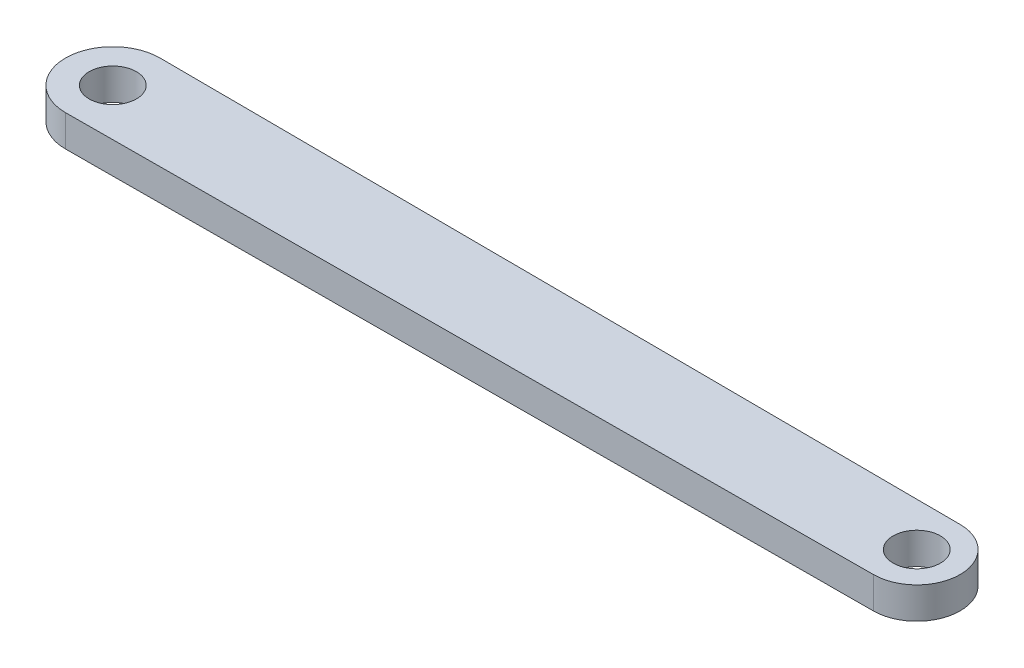
ISO-10303-21;
HEADER;
FILE_DESCRIPTION(('STEP AP214'),'2;1');
FILE_NAME('part.step','',(''),(''),'','','');
FILE_SCHEMA(('AUTOMOTIVE_DESIGN { 1 0 10303 214 1 1 1 1 }'));
ENDSEC;
DATA;
#1=APPLICATION_CONTEXT('core data for automotive mechanical design processes');
#2=APPLICATION_PROTOCOL_DEFINITION('international standard','automotive_design',2000,#1);
#3=PRODUCT_CONTEXT('',#1,'mechanical');
#4=PRODUCT('Part','Part','',(#3));
#5=PRODUCT_RELATED_PRODUCT_CATEGORY('part','',(#4));
#6=PRODUCT_DEFINITION_FORMATION('','',#4);
#7=PRODUCT_DEFINITION_CONTEXT('part definition',#1,'design');
#8=PRODUCT_DEFINITION('design','',#6,#7);
#9=PRODUCT_DEFINITION_SHAPE('','',#8);
#10=(LENGTH_UNIT() NAMED_UNIT(*) SI_UNIT(.MILLI.,.METRE.));
#11=(NAMED_UNIT(*) PLANE_ANGLE_UNIT() SI_UNIT($,.RADIAN.));
#12=(NAMED_UNIT(*) SI_UNIT($,.STERADIAN.) SOLID_ANGLE_UNIT());
#13=UNCERTAINTY_MEASURE_WITH_UNIT(LENGTH_MEASURE(1.E-05),#10,'distance_accuracy_value','');
#14=(GEOMETRIC_REPRESENTATION_CONTEXT(3) GLOBAL_UNCERTAINTY_ASSIGNED_CONTEXT((#13)) GLOBAL_UNIT_ASSIGNED_CONTEXT((#10,
#11,#12)) REPRESENTATION_CONTEXT('',''));
#15=CARTESIAN_POINT('',(0.,0.,0.));
#16=DIRECTION('',(0.,0.,1.));
#17=DIRECTION('',(1.,0.,0.));
#18=AXIS2_PLACEMENT_3D('',#15,#16,#17);
#19=CARTESIAN_POINT('',(-51.,1.,0.));
#20=DIRECTION('',(0.,1.,0.));
#21=DIRECTION('',(0.,0.,1.));
#22=AXIS2_PLACEMENT_3D('',#19,#20,#21);
#23=PLANE('',#22);
#24=CARTESIAN_POINT('',(0.,1.,0.));
#25=DIRECTION('',(0.,1.,0.));
#26=DIRECTION('',(0.,0.,1.));
#27=AXIS2_PLACEMENT_3D('',#24,#25,#26);
#28=CIRCLE('',#27,1.5);
#29=CARTESIAN_POINT('',(0.,1.,1.5));
#30=VERTEX_POINT('',#29);
#31=EDGE_CURVE('E136',#30,#30,#28,.T.);
#32=ORIENTED_EDGE('',*,*,#31,.F.);
#33=EDGE_LOOP('',(#32));
#34=FACE_BOUND('',#33,.T.);
#35=CARTESIAN_POINT('',(-51.,1.,0.));
#36=DIRECTION('',(0.,1.,0.));
#37=DIRECTION('',(0.,0.,1.));
#38=AXIS2_PLACEMENT_3D('',#35,#36,#37);
#39=CIRCLE('',#38,3.);
#40=CARTESIAN_POINT('',(-50.9852941176471,1.,-2.99996395595418));
#41=VERTEX_POINT('',#40);
#42=CARTESIAN_POINT('',(-50.9852941176471,1.,2.99996395595418));
#43=VERTEX_POINT('',#42);
#44=EDGE_CURVE('E94',#41,#43,#39,.T.);
#45=ORIENTED_EDGE('',*,*,#44,.T.);
#46=DIRECTION('',(0.999987985318058,0.,-0.00490196078431374));
#47=VECTOR('',#46,1.);
#48=CARTESIAN_POINT('',(-50.9852941176471,1.,2.99996395595418));
#49=LINE('',#48,#47);
#50=CARTESIAN_POINT('',(0.0134803921568628,1.,2.74996695962466));
#51=VERTEX_POINT('',#50);
#52=EDGE_CURVE('E89',#43,#51,#49,.T.);
#53=ORIENTED_EDGE('',*,*,#52,.T.);
#54=CARTESIAN_POINT('',(0.,1.,0.));
#55=DIRECTION('',(0.,1.,0.));
#56=DIRECTION('',(0.,0.,1.));
#57=AXIS2_PLACEMENT_3D('',#54,#55,#56);
#58=CIRCLE('',#57,2.75);
#59=CARTESIAN_POINT('',(0.0134803921568628,1.,-2.74996695962466));
#60=VERTEX_POINT('',#59);
#61=EDGE_CURVE('E92',#51,#60,#58,.T.);
#62=ORIENTED_EDGE('',*,*,#61,.T.);
#63=DIRECTION('',(-0.999987985318058,0.,-0.00490196078431374));
#64=VECTOR('',#63,1.);
#65=CARTESIAN_POINT('',(-50.9852941176471,1.,-2.99996395595418));
#66=LINE('',#65,#64);
#67=EDGE_CURVE('E59',#60,#41,#66,.T.);
#68=ORIENTED_EDGE('',*,*,#67,.T.);
#69=EDGE_LOOP('',(#45,#53,#62,#68));
#70=FACE_BOUND('',#69,.T.);
#71=CARTESIAN_POINT('',(-51.,1.,0.));
#72=DIRECTION('',(0.,1.,0.));
#73=DIRECTION('',(0.,0.,1.));
#74=AXIS2_PLACEMENT_3D('',#71,#72,#73);
#75=CIRCLE('',#74,1.5);
#76=CARTESIAN_POINT('',(-51.,1.,1.5));
#77=VERTEX_POINT('',#76);
#78=EDGE_CURVE('E114',#77,#77,#75,.T.);
#79=ORIENTED_EDGE('',*,*,#78,.F.);
#80=EDGE_LOOP('',(#79));
#81=FACE_BOUND('',#80,.T.);
#82=ADVANCED_FACE('F41',(#34,#70,#81),#23,.T.);
#83=CARTESIAN_POINT('',(-51.,-1.,0.));
#84=DIRECTION('',(0.,1.,0.));
#85=DIRECTION('',(0.,0.,1.));
#86=AXIS2_PLACEMENT_3D('',#83,#84,#85);
#87=PLANE('',#86);
#88=CARTESIAN_POINT('',(0.,-1.,0.));
#89=DIRECTION('',(0.,1.,0.));
#90=DIRECTION('',(0.,0.,1.));
#91=AXIS2_PLACEMENT_3D('',#88,#89,#90);
#92=CIRCLE('',#91,1.5);
#93=CARTESIAN_POINT('',(0.,-1.,1.5));
#94=VERTEX_POINT('',#93);
#95=EDGE_CURVE('E143',#94,#94,#92,.T.);
#96=ORIENTED_EDGE('',*,*,#95,.T.);
#97=EDGE_LOOP('',(#96));
#98=FACE_BOUND('',#97,.T.);
#99=CARTESIAN_POINT('',(-51.,-1.,0.));
#100=DIRECTION('',(0.,1.,0.));
#101=DIRECTION('',(0.,0.,1.));
#102=AXIS2_PLACEMENT_3D('',#99,#100,#101);
#103=CIRCLE('',#102,3.);
#104=CARTESIAN_POINT('',(-50.9852941176471,-1.,-2.99996395595418));
#105=VERTEX_POINT('',#104);
#106=CARTESIAN_POINT('',(-50.9852941176471,-1.,2.99996395595418));
#107=VERTEX_POINT('',#106);
#108=EDGE_CURVE('E110',#105,#107,#103,.T.);
#109=ORIENTED_EDGE('',*,*,#108,.F.);
#110=DIRECTION('',(-0.999987985318058,0.,-0.00490196078431374));
#111=VECTOR('',#110,1.);
#112=CARTESIAN_POINT('',(-50.9852941176471,-1.,-2.99996395595418));
#113=LINE('',#112,#111);
#114=CARTESIAN_POINT('',(0.0134803921568628,-1.,-2.74996695962466));
#115=VERTEX_POINT('',#114);
#116=EDGE_CURVE('E82',#115,#105,#113,.T.);
#117=ORIENTED_EDGE('',*,*,#116,.F.);
#118=CARTESIAN_POINT('',(0.,-1.,0.));
#119=DIRECTION('',(0.,1.,0.));
#120=DIRECTION('',(0.,0.,1.));
#121=AXIS2_PLACEMENT_3D('',#118,#119,#120);
#122=CIRCLE('',#121,2.75);
#123=CARTESIAN_POINT('',(0.0134803921568628,-1.,2.74996695962466));
#124=VERTEX_POINT('',#123);
#125=EDGE_CURVE('E76',#124,#115,#122,.T.);
#126=ORIENTED_EDGE('',*,*,#125,.F.);
#127=DIRECTION('',(0.999987985318058,0.,-0.00490196078431374));
#128=VECTOR('',#127,1.);
#129=CARTESIAN_POINT('',(-50.9852941176471,-1.,2.99996395595418));
#130=LINE('',#129,#128);
#131=EDGE_CURVE('E99',#107,#124,#130,.T.);
#132=ORIENTED_EDGE('',*,*,#131,.F.);
#133=EDGE_LOOP('',(#109,#117,#126,#132));
#134=FACE_BOUND('',#133,.T.);
#135=CARTESIAN_POINT('',(-51.,-1.,0.));
#136=DIRECTION('',(0.,1.,0.));
#137=DIRECTION('',(0.,0.,1.));
#138=AXIS2_PLACEMENT_3D('',#135,#136,#137);
#139=CIRCLE('',#138,1.5);
#140=CARTESIAN_POINT('',(-51.,-1.,1.5));
#141=VERTEX_POINT('',#140);
#142=EDGE_CURVE('E132',#141,#141,#139,.T.);
#143=ORIENTED_EDGE('',*,*,#142,.T.);
#144=EDGE_LOOP('',(#143));
#145=FACE_BOUND('',#144,.T.);
#146=ADVANCED_FACE('F127',(#98,#134,#145),#87,.F.);
#147=CARTESIAN_POINT('',(-51.,1.,0.));
#148=DIRECTION('',(0.,-1.,0.));
#149=DIRECTION('',(0.,0.,-1.));
#150=AXIS2_PLACEMENT_3D('',#147,#148,#149);
#151=CYLINDRICAL_SURFACE('',#150,3.);
#152=ORIENTED_EDGE('',*,*,#108,.T.);
#153=DIRECTION('',(0.,-1.,0.));
#154=VECTOR('',#153,1.);
#155=CARTESIAN_POINT('',(-50.9852941176471,1.,2.99996395595418));
#156=LINE('',#155,#154);
#157=EDGE_CURVE('E11',#43,#107,#156,.T.);
#158=ORIENTED_EDGE('',*,*,#157,.F.);
#159=ORIENTED_EDGE('',*,*,#44,.F.);
#160=DIRECTION('',(0.,-1.,0.));
#161=VECTOR('',#160,1.);
#162=CARTESIAN_POINT('',(-50.9852941176471,1.,-2.99996395595418));
#163=LINE('',#162,#161);
#164=EDGE_CURVE('E106',#41,#105,#163,.T.);
#165=ORIENTED_EDGE('',*,*,#164,.T.);
#166=EDGE_LOOP('',(#152,#158,#159,#165));
#167=FACE_BOUND('',#166,.T.);
#168=ADVANCED_FACE('F43',(#167),#151,.T.);
#169=CARTESIAN_POINT('',(-50.9852941176471,1.,2.99996395595418));
#170=DIRECTION('',(-0.00490196078431374,0.,-0.999987985318058));
#171=DIRECTION('',(-0.999987985318058,0.,0.00490196078431374));
#172=AXIS2_PLACEMENT_3D('',#169,#170,#171);
#173=PLANE('',#172);
#174=ORIENTED_EDGE('',*,*,#131,.T.);
#175=DIRECTION('',(0.,-1.,0.));
#176=VECTOR('',#175,1.);
#177=CARTESIAN_POINT('',(0.0134803921568628,1.,2.74996695962466));
#178=LINE('',#177,#176);
#179=EDGE_CURVE('E51',#51,#124,#178,.T.);
#180=ORIENTED_EDGE('',*,*,#179,.F.);
#181=ORIENTED_EDGE('',*,*,#52,.F.);
#182=ORIENTED_EDGE('',*,*,#157,.T.);
#183=EDGE_LOOP('',(#174,#180,#181,#182));
#184=FACE_BOUND('',#183,.T.);
#185=ADVANCED_FACE('F98',(#184),#173,.F.);
#186=CARTESIAN_POINT('',(0.,1.,0.));
#187=DIRECTION('',(0.,-1.,0.));
#188=DIRECTION('',(0.,0.,-1.));
#189=AXIS2_PLACEMENT_3D('',#186,#187,#188);
#190=CYLINDRICAL_SURFACE('',#189,2.75);
#191=ORIENTED_EDGE('',*,*,#125,.T.);
#192=DIRECTION('',(0.,-1.,0.));
#193=VECTOR('',#192,1.);
#194=CARTESIAN_POINT('',(0.0134803921568628,1.,-2.74996695962466));
#195=LINE('',#194,#193);
#196=EDGE_CURVE('E101',#60,#115,#195,.T.);
#197=ORIENTED_EDGE('',*,*,#196,.F.);
#198=ORIENTED_EDGE('',*,*,#61,.F.);
#199=ORIENTED_EDGE('',*,*,#179,.T.);
#200=EDGE_LOOP('',(#191,#197,#198,#199));
#201=FACE_BOUND('',#200,.T.);
#202=ADVANCED_FACE('F102',(#201),#190,.T.);
#203=CARTESIAN_POINT('',(-50.9852941176471,1.,-2.99996395595418));
#204=DIRECTION('',(-0.00490196078431374,0.,0.999987985318058));
#205=DIRECTION('',(0.999987985318058,0.,0.00490196078431374));
#206=AXIS2_PLACEMENT_3D('',#203,#204,#205);
#207=PLANE('',#206);
#208=ORIENTED_EDGE('',*,*,#116,.T.);
#209=ORIENTED_EDGE('',*,*,#164,.F.);
#210=ORIENTED_EDGE('',*,*,#67,.F.);
#211=ORIENTED_EDGE('',*,*,#196,.T.);
#212=EDGE_LOOP('',(#208,#209,#210,#211));
#213=FACE_BOUND('',#212,.T.);
#214=ADVANCED_FACE('F124',(#213),#207,.F.);
#215=CARTESIAN_POINT('',(-51.,1.,0.));
#216=DIRECTION('',(0.,-1.,0.));
#217=DIRECTION('',(0.,0.,-1.));
#218=AXIS2_PLACEMENT_3D('',#215,#216,#217);
#219=CYLINDRICAL_SURFACE('',#218,1.5);
#220=ORIENTED_EDGE('',*,*,#78,.T.);
#221=EDGE_LOOP('',(#220));
#222=FACE_BOUND('',#221,.T.);
#223=ORIENTED_EDGE('',*,*,#142,.F.);
#224=EDGE_LOOP('',(#223));
#225=FACE_BOUND('',#224,.T.);
#226=ADVANCED_FACE('F151',(#222,#225),#219,.F.);
#227=CARTESIAN_POINT('',(0.,-20.,0.));
#228=DIRECTION('',(0.,1.,0.));
#229=DIRECTION('',(0.,0.,1.));
#230=AXIS2_PLACEMENT_3D('',#227,#228,#229);
#231=CYLINDRICAL_SURFACE('',#230,1.5);
#232=ORIENTED_EDGE('',*,*,#31,.T.);
#233=EDGE_LOOP('',(#232));
#234=FACE_BOUND('',#233,.T.);
#235=ORIENTED_EDGE('',*,*,#95,.F.);
#236=EDGE_LOOP('',(#235));
#237=FACE_BOUND('',#236,.T.);
#238=ADVANCED_FACE('F149',(#234,#237),#231,.F.);
#239=CLOSED_SHELL('',(#82,#146,#168,#185,#202,#214,#226,#238));
#240=MANIFOLD_SOLID_BREP('B2',#239);
#241=ADVANCED_BREP_SHAPE_REPRESENTATION('',(#18,#240),#14);
#242=SHAPE_DEFINITION_REPRESENTATION(#9,#241);
ENDSEC;
END-ISO-10303-21;
